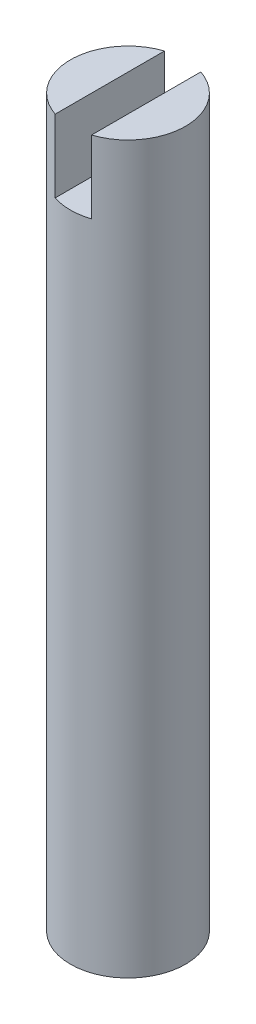
ISO-10303-21;
HEADER;
FILE_DESCRIPTION(('STEP AP214'),'2;1');
FILE_NAME('part.step','',(''),(''),'','','');
FILE_SCHEMA(('AUTOMOTIVE_DESIGN { 1 0 10303 214 1 1 1 1 }'));
ENDSEC;
DATA;
#1=APPLICATION_CONTEXT('core data for automotive mechanical design processes');
#2=APPLICATION_PROTOCOL_DEFINITION('international standard','automotive_design',2000,#1);
#3=PRODUCT_CONTEXT('',#1,'mechanical');
#4=PRODUCT('Part','Part','',(#3));
#5=PRODUCT_RELATED_PRODUCT_CATEGORY('part','',(#4));
#6=PRODUCT_DEFINITION_FORMATION('','',#4);
#7=PRODUCT_DEFINITION_CONTEXT('part definition',#1,'design');
#8=PRODUCT_DEFINITION('design','',#6,#7);
#9=PRODUCT_DEFINITION_SHAPE('','',#8);
#10=(LENGTH_UNIT() NAMED_UNIT(*) SI_UNIT(.MILLI.,.METRE.));
#11=(NAMED_UNIT(*) PLANE_ANGLE_UNIT() SI_UNIT($,.RADIAN.));
#12=(NAMED_UNIT(*) SI_UNIT($,.STERADIAN.) SOLID_ANGLE_UNIT());
#13=UNCERTAINTY_MEASURE_WITH_UNIT(LENGTH_MEASURE(1.E-05),#10,'distance_accuracy_value','');
#14=(GEOMETRIC_REPRESENTATION_CONTEXT(3) GLOBAL_UNCERTAINTY_ASSIGNED_CONTEXT((#13)) GLOBAL_UNIT_ASSIGNED_CONTEXT((#10,
#11,#12)) REPRESENTATION_CONTEXT('',''));
#15=CARTESIAN_POINT('',(0.,0.,0.));
#16=DIRECTION('',(0.,0.,1.));
#17=DIRECTION('',(1.,0.,0.));
#18=AXIS2_PLACEMENT_3D('',#15,#16,#17);
#19=CARTESIAN_POINT('',(0.,20.,0.));
#20=DIRECTION('',(0.,-1.,0.));
#21=DIRECTION('',(0.,0.,-1.));
#22=AXIS2_PLACEMENT_3D('',#19,#20,#21);
#23=CYLINDRICAL_SURFACE('',#22,1.587);
#24=CARTESIAN_POINT('',(0.,0.,0.));
#25=DIRECTION('',(0.,1.,0.));
#26=DIRECTION('',(0.,0.,1.));
#27=AXIS2_PLACEMENT_3D('',#24,#25,#26);
#28=CIRCLE('',#27,1.587);
#29=CARTESIAN_POINT('',(0.,0.,1.587));
#30=VERTEX_POINT('',#29);
#31=EDGE_CURVE('E42',#30,#30,#28,.T.);
#32=ORIENTED_EDGE('',*,*,#31,.T.);
#33=EDGE_LOOP('',(#32));
#34=FACE_BOUND('',#33,.T.);
#35=DIRECTION('',(0.,1.,0.));
#36=VECTOR('',#35,1.);
#37=CARTESIAN_POINT('',(0.5,18.,-1.50617694843601));
#38=LINE('',#37,#36);
#39=CARTESIAN_POINT('',(0.5,18.,-1.50617694843601));
#40=VERTEX_POINT('',#39);
#41=CARTESIAN_POINT('',(0.5,20.,-1.50617694843601));
#42=VERTEX_POINT('',#41);
#43=EDGE_CURVE('E82',#40,#42,#38,.T.);
#44=ORIENTED_EDGE('',*,*,#43,.T.);
#45=CARTESIAN_POINT('',(0.,20.,0.));
#46=DIRECTION('',(0.,1.,0.));
#47=DIRECTION('',(0.,0.,1.));
#48=AXIS2_PLACEMENT_3D('',#45,#46,#47);
#49=CIRCLE('',#48,1.587);
#50=CARTESIAN_POINT('',(0.5,20.,1.50617694843601));
#51=VERTEX_POINT('',#50);
#52=EDGE_CURVE('E11',#51,#42,#49,.T.);
#53=ORIENTED_EDGE('',*,*,#52,.F.);
#54=DIRECTION('',(0.,1.,0.));
#55=VECTOR('',#54,1.);
#56=CARTESIAN_POINT('',(0.5,18.,1.50617694843601));
#57=LINE('',#56,#55);
#58=CARTESIAN_POINT('',(0.5,18.,1.50617694843601));
#59=VERTEX_POINT('',#58);
#60=EDGE_CURVE('E78',#59,#51,#57,.T.);
#61=ORIENTED_EDGE('',*,*,#60,.F.);
#62=CARTESIAN_POINT('',(0.,18.,0.));
#63=DIRECTION('',(0.,1.,0.));
#64=DIRECTION('',(0.,0.,1.));
#65=AXIS2_PLACEMENT_3D('',#62,#63,#64);
#66=CIRCLE('',#65,1.587);
#67=CARTESIAN_POINT('',(-0.5,18.,1.50617694843601));
#68=VERTEX_POINT('',#67);
#69=EDGE_CURVE('E92',#68,#59,#66,.T.);
#70=ORIENTED_EDGE('',*,*,#69,.F.);
#71=DIRECTION('',(0.,1.,0.));
#72=VECTOR('',#71,1.);
#73=CARTESIAN_POINT('',(-0.5,18.,1.50617694843601));
#74=LINE('',#73,#72);
#75=CARTESIAN_POINT('',(-0.5,20.,1.50617694843601));
#76=VERTEX_POINT('',#75);
#77=EDGE_CURVE('E88',#68,#76,#74,.T.);
#78=ORIENTED_EDGE('',*,*,#77,.T.);
#79=CARTESIAN_POINT('',(-0.5,20.,-1.50617694843601));
#80=VERTEX_POINT('',#79);
#81=EDGE_CURVE('E48',#80,#76,#49,.T.);
#82=ORIENTED_EDGE('',*,*,#81,.F.);
#83=DIRECTION('',(0.,1.,0.));
#84=VECTOR('',#83,1.);
#85=CARTESIAN_POINT('',(-0.5,18.,-1.50617694843601));
#86=LINE('',#85,#84);
#87=CARTESIAN_POINT('',(-0.5,18.,-1.50617694843601));
#88=VERTEX_POINT('',#87);
#89=EDGE_CURVE('E55',#88,#80,#86,.T.);
#90=ORIENTED_EDGE('',*,*,#89,.F.);
#91=EDGE_CURVE('E93',#40,#88,#66,.T.);
#92=ORIENTED_EDGE('',*,*,#91,.F.);
#93=EDGE_LOOP('',(#44,#53,#61,#70,#78,#82,#90,#92));
#94=FACE_BOUND('',#93,.T.);
#95=ADVANCED_FACE('F39',(#34,#94),#23,.T.);
#96=CARTESIAN_POINT('',(0.,20.,0.));
#97=DIRECTION('',(0.,1.,0.));
#98=DIRECTION('',(0.,0.,1.));
#99=AXIS2_PLACEMENT_3D('',#96,#97,#98);
#100=PLANE('',#99);
#101=ORIENTED_EDGE('',*,*,#52,.T.);
#102=DIRECTION('',(0.,0.,1.));
#103=VECTOR('',#102,1.);
#104=CARTESIAN_POINT('',(0.5,20.,0.));
#105=LINE('',#104,#103);
#106=EDGE_CURVE('E114',#42,#51,#105,.T.);
#107=ORIENTED_EDGE('',*,*,#106,.T.);
#108=EDGE_LOOP('',(#101,#107));
#109=FACE_BOUND('',#108,.T.);
#110=ADVANCED_FACE('F121',(#109),#100,.T.);
#111=DIRECTION('',(0.,0.,1.));
#112=VECTOR('',#111,1.);
#113=CARTESIAN_POINT('',(-0.5,20.,0.));
#114=LINE('',#113,#112);
#115=EDGE_CURVE('E111',#80,#76,#114,.T.);
#116=ORIENTED_EDGE('',*,*,#115,.F.);
#117=ORIENTED_EDGE('',*,*,#81,.T.);
#118=EDGE_LOOP('',(#116,#117));
#119=FACE_BOUND('',#118,.T.);
#120=ADVANCED_FACE('F131',(#119),#100,.T.);
#121=CARTESIAN_POINT('',(0.,0.,0.));
#122=DIRECTION('',(0.,1.,0.));
#123=DIRECTION('',(0.,0.,1.));
#124=AXIS2_PLACEMENT_3D('',#121,#122,#123);
#125=PLANE('',#124);
#126=ORIENTED_EDGE('',*,*,#31,.F.);
#127=EDGE_LOOP('',(#126));
#128=FACE_BOUND('',#127,.T.);
#129=ADVANCED_FACE('F124',(#128),#125,.F.);
#130=CARTESIAN_POINT('',(0.5,18.,0.));
#131=DIRECTION('',(-1.,0.,0.));
#132=DIRECTION('',(0.,0.,1.));
#133=AXIS2_PLACEMENT_3D('',#130,#131,#132);
#134=PLANE('',#133);
#135=ORIENTED_EDGE('',*,*,#106,.F.);
#136=ORIENTED_EDGE('',*,*,#43,.F.);
#137=DIRECTION('',(0.,0.,1.));
#138=VECTOR('',#137,1.);
#139=CARTESIAN_POINT('',(0.5,18.,0.));
#140=LINE('',#139,#138);
#141=EDGE_CURVE('E64',#40,#59,#140,.T.);
#142=ORIENTED_EDGE('',*,*,#141,.T.);
#143=ORIENTED_EDGE('',*,*,#60,.T.);
#144=EDGE_LOOP('',(#135,#136,#142,#143));
#145=FACE_BOUND('',#144,.T.);
#146=ADVANCED_FACE('F122',(#145),#134,.T.);
#147=CARTESIAN_POINT('',(-0.5,18.,0.));
#148=DIRECTION('',(-1.,0.,0.));
#149=DIRECTION('',(0.,0.,1.));
#150=AXIS2_PLACEMENT_3D('',#147,#148,#149);
#151=PLANE('',#150);
#152=ORIENTED_EDGE('',*,*,#115,.T.);
#153=ORIENTED_EDGE('',*,*,#77,.F.);
#154=DIRECTION('',(0.,0.,1.));
#155=VECTOR('',#154,1.);
#156=CARTESIAN_POINT('',(-0.5,18.,0.));
#157=LINE('',#156,#155);
#158=EDGE_CURVE('E84',#88,#68,#157,.T.);
#159=ORIENTED_EDGE('',*,*,#158,.F.);
#160=ORIENTED_EDGE('',*,*,#89,.T.);
#161=EDGE_LOOP('',(#152,#153,#159,#160));
#162=FACE_BOUND('',#161,.T.);
#163=ADVANCED_FACE('F86',(#162),#151,.F.);
#164=CARTESIAN_POINT('',(0.,18.,0.));
#165=DIRECTION('',(0.,1.,0.));
#166=DIRECTION('',(0.,0.,1.));
#167=AXIS2_PLACEMENT_3D('',#164,#165,#166);
#168=PLANE('',#167);
#169=ORIENTED_EDGE('',*,*,#141,.F.);
#170=ORIENTED_EDGE('',*,*,#91,.T.);
#171=ORIENTED_EDGE('',*,*,#158,.T.);
#172=ORIENTED_EDGE('',*,*,#69,.T.);
#173=EDGE_LOOP('',(#169,#170,#171,#172));
#174=FACE_BOUND('',#173,.T.);
#175=ADVANCED_FACE('F96',(#174),#168,.T.);
#176=CLOSED_SHELL('',(#95,#110,#120,#129,#146,#163,#175));
#177=MANIFOLD_SOLID_BREP('B2',#176);
#178=ADVANCED_BREP_SHAPE_REPRESENTATION('',(#18,#177),#14);
#179=SHAPE_DEFINITION_REPRESENTATION(#9,#178);
ENDSEC;
END-ISO-10303-21;
